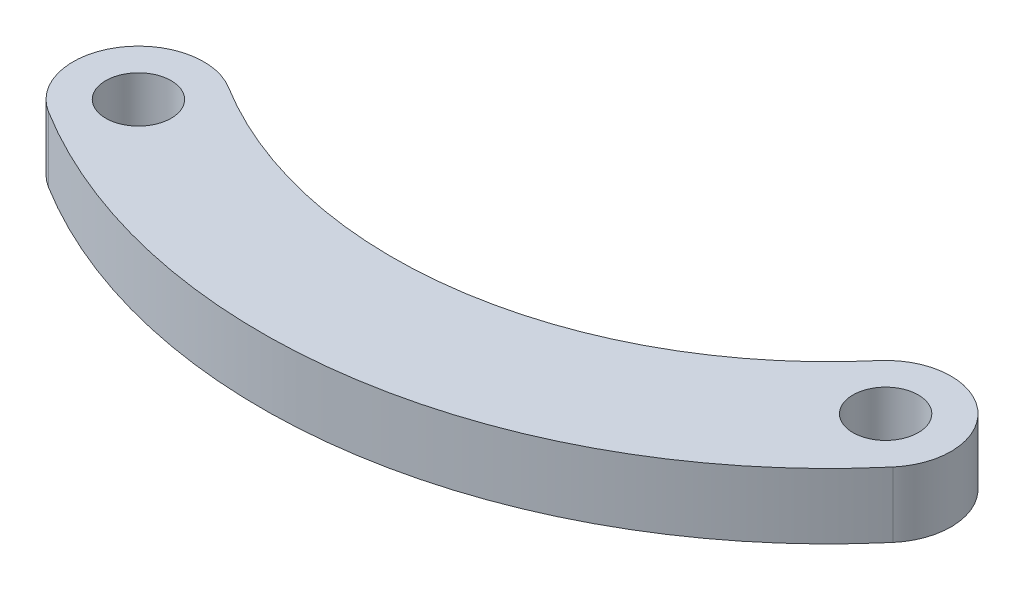
ISO-10303-21;
HEADER;
FILE_DESCRIPTION(('STEP AP214'),'2;1');
FILE_NAME('part.step','',(''),(''),'','','');
FILE_SCHEMA(('AUTOMOTIVE_DESIGN { 1 0 10303 214 1 1 1 1 }'));
ENDSEC;
DATA;
#1=APPLICATION_CONTEXT('core data for automotive mechanical design processes');
#2=APPLICATION_PROTOCOL_DEFINITION('international standard','automotive_design',2000,#1);
#3=PRODUCT_CONTEXT('',#1,'mechanical');
#4=PRODUCT('Part','Part','',(#3));
#5=PRODUCT_RELATED_PRODUCT_CATEGORY('part','',(#4));
#6=PRODUCT_DEFINITION_FORMATION('','',#4);
#7=PRODUCT_DEFINITION_CONTEXT('part definition',#1,'design');
#8=PRODUCT_DEFINITION('design','',#6,#7);
#9=PRODUCT_DEFINITION_SHAPE('','',#8);
#10=(LENGTH_UNIT() NAMED_UNIT(*) SI_UNIT(.MILLI.,.METRE.));
#11=(NAMED_UNIT(*) PLANE_ANGLE_UNIT() SI_UNIT($,.RADIAN.));
#12=(NAMED_UNIT(*) SI_UNIT($,.STERADIAN.) SOLID_ANGLE_UNIT());
#13=UNCERTAINTY_MEASURE_WITH_UNIT(LENGTH_MEASURE(1.E-05),#10,'distance_accuracy_value','');
#14=(GEOMETRIC_REPRESENTATION_CONTEXT(3) GLOBAL_UNCERTAINTY_ASSIGNED_CONTEXT((#13)) GLOBAL_UNIT_ASSIGNED_CONTEXT((#10,
#11,#12)) REPRESENTATION_CONTEXT('',''));
#15=CARTESIAN_POINT('',(0.,0.,0.));
#16=DIRECTION('',(0.,0.,1.));
#17=DIRECTION('',(1.,0.,0.));
#18=AXIS2_PLACEMENT_3D('',#15,#16,#17);
#19=CARTESIAN_POINT('',(-38.4645273407542,19.05,62.0735914979339));
#20=DIRECTION('',(0.,1.,0.));
#21=DIRECTION('',(0.,0.,1.));
#22=AXIS2_PLACEMENT_3D('',#19,#20,#21);
#23=PLANE('',#22);
#24=CARTESIAN_POINT('',(-76.9290546815084,19.05,124.147182995868));
#25=DIRECTION('',(0.,1.,0.));
#26=DIRECTION('',(0.,0.,1.));
#27=AXIS2_PLACEMENT_3D('',#24,#25,#26);
#28=CIRCLE('',#27,9.52500000000001);
#29=CARTESIAN_POINT('',(-76.9290546815084,19.05,114.622182995868));
#30=VERTEX_POINT('',#29);
#31=EDGE_CURVE('E100',#30,#30,#28,.T.);
#32=ORIENTED_EDGE('',*,*,#31,.F.);
#33=EDGE_LOOP('',(#32));
#34=FACE_BOUND('',#33,.T.);
#35=CARTESIAN_POINT('',(-76.9290546815084,19.05,124.147182995868));
#36=DIRECTION('',(0.,1.,0.));
#37=DIRECTION('',(0.,0.,1.));
#38=AXIS2_PLACEMENT_3D('',#35,#36,#37);
#39=CIRCLE('',#38,19.05);
#40=CARTESIAN_POINT('',(-66.8948301578335,19.05,107.95407217032));
#41=VERTEX_POINT('',#40);
#42=CARTESIAN_POINT('',(-86.9632792051835,19.05,140.340293821416));
#43=VERTEX_POINT('',#42);
#44=EDGE_CURVE('E85',#41,#43,#39,.T.);
#45=ORIENTED_EDGE('',*,*,#44,.T.);
#46=CARTESIAN_POINT('',(0.,19.05,0.));
#47=DIRECTION('',(0.,1.,0.));
#48=DIRECTION('',(0.,0.,1.));
#49=AXIS2_PLACEMENT_3D('',#46,#47,#48);
#50=CIRCLE('',#49,165.1);
#51=CARTESIAN_POINT('',(125.779584044827,19.05,106.946277342928));
#52=VERTEX_POINT('',#51);
#53=EDGE_CURVE('E80',#43,#52,#50,.T.);
#54=ORIENTED_EDGE('',*,*,#53,.T.);
#55=CARTESIAN_POINT('',(111.266555116578,19.05,94.6063222648974));
#56=DIRECTION('',(0.,1.,0.));
#57=DIRECTION('',(0.,0.,1.));
#58=AXIS2_PLACEMENT_3D('',#55,#56,#57);
#59=CIRCLE('',#58,19.05);
#60=CARTESIAN_POINT('',(96.7535261883283,19.05,82.2663671868673));
#61=VERTEX_POINT('',#60);
#62=EDGE_CURVE('E83',#52,#61,#59,.T.);
#63=ORIENTED_EDGE('',*,*,#62,.T.);
#64=CARTESIAN_POINT('',(0.,19.05,0.));
#65=DIRECTION('',(0.,-1.,0.));
#66=DIRECTION('',(0.,0.,1.));
#67=AXIS2_PLACEMENT_3D('',#64,#65,#66);
#68=CIRCLE('',#67,127.);
#69=EDGE_CURVE('E50',#61,#41,#68,.T.);
#70=ORIENTED_EDGE('',*,*,#69,.T.);
#71=EDGE_LOOP('',(#45,#54,#63,#70));
#72=FACE_BOUND('',#71,.T.);
#73=CARTESIAN_POINT('',(111.266555116578,19.05,94.6063222648974));
#74=DIRECTION('',(0.,1.,0.));
#75=DIRECTION('',(0.,0.,1.));
#76=AXIS2_PLACEMENT_3D('',#73,#74,#75);
#77=CIRCLE('',#76,9.52500000000001);
#78=CARTESIAN_POINT('',(111.266555116578,19.05,85.0813222648974));
#79=VERTEX_POINT('',#78);
#80=EDGE_CURVE('E115',#79,#79,#77,.T.);
#81=ORIENTED_EDGE('',*,*,#80,.F.);
#82=EDGE_LOOP('',(#81));
#83=FACE_BOUND('',#82,.T.);
#84=ADVANCED_FACE('F33',(#34,#72,#83),#23,.T.);
#85=CARTESIAN_POINT('',(-38.4645273407542,0.,62.0735914979339));
#86=DIRECTION('',(0.,1.,0.));
#87=DIRECTION('',(0.,0.,1.));
#88=AXIS2_PLACEMENT_3D('',#85,#86,#87);
#89=PLANE('',#88);
#90=CARTESIAN_POINT('',(-76.9290546815084,0.,124.147182995868));
#91=DIRECTION('',(0.,1.,0.));
#92=DIRECTION('',(0.,0.,1.));
#93=AXIS2_PLACEMENT_3D('',#90,#91,#92);
#94=CIRCLE('',#93,19.05);
#95=CARTESIAN_POINT('',(-66.8948301578335,0.,107.95407217032));
#96=VERTEX_POINT('',#95);
#97=CARTESIAN_POINT('',(-86.9632792051835,0.,140.340293821416));
#98=VERTEX_POINT('',#97);
#99=EDGE_CURVE('E97',#96,#98,#94,.T.);
#100=ORIENTED_EDGE('',*,*,#99,.F.);
#101=CARTESIAN_POINT('',(0.,0.,0.));
#102=DIRECTION('',(0.,-1.,0.));
#103=DIRECTION('',(0.,0.,1.));
#104=AXIS2_PLACEMENT_3D('',#101,#102,#103);
#105=CIRCLE('',#104,127.);
#106=CARTESIAN_POINT('',(96.7535261883283,0.,82.2663671868673));
#107=VERTEX_POINT('',#106);
#108=EDGE_CURVE('E73',#107,#96,#105,.T.);
#109=ORIENTED_EDGE('',*,*,#108,.F.);
#110=CARTESIAN_POINT('',(111.266555116578,0.,94.6063222648974));
#111=DIRECTION('',(0.,1.,0.));
#112=DIRECTION('',(0.,0.,1.));
#113=AXIS2_PLACEMENT_3D('',#110,#111,#112);
#114=CIRCLE('',#113,19.05);
#115=CARTESIAN_POINT('',(125.779584044827,0.,106.946277342928));
#116=VERTEX_POINT('',#115);
#117=EDGE_CURVE('E67',#116,#107,#114,.T.);
#118=ORIENTED_EDGE('',*,*,#117,.F.);
#119=CARTESIAN_POINT('',(0.,0.,0.));
#120=DIRECTION('',(0.,1.,0.));
#121=DIRECTION('',(0.,0.,1.));
#122=AXIS2_PLACEMENT_3D('',#119,#120,#121);
#123=CIRCLE('',#122,165.1);
#124=EDGE_CURVE('E89',#98,#116,#123,.T.);
#125=ORIENTED_EDGE('',*,*,#124,.F.);
#126=EDGE_LOOP('',(#100,#109,#118,#125));
#127=FACE_BOUND('',#126,.T.);
#128=CARTESIAN_POINT('',(-76.9290546815084,0.,124.147182995868));
#129=DIRECTION('',(0.,1.,0.));
#130=DIRECTION('',(0.,0.,1.));
#131=AXIS2_PLACEMENT_3D('',#128,#129,#130);
#132=CIRCLE('',#131,9.52500000000001);
#133=CARTESIAN_POINT('',(-76.9290546815084,0.,114.622182995868));
#134=VERTEX_POINT('',#133);
#135=EDGE_CURVE('E112',#134,#134,#132,.T.);
#136=ORIENTED_EDGE('',*,*,#135,.T.);
#137=EDGE_LOOP('',(#136));
#138=FACE_BOUND('',#137,.T.);
#139=CARTESIAN_POINT('',(111.266555116578,0.,94.6063222648974));
#140=DIRECTION('',(0.,1.,0.));
#141=DIRECTION('',(0.,0.,1.));
#142=AXIS2_PLACEMENT_3D('',#139,#140,#141);
#143=CIRCLE('',#142,9.52500000000001);
#144=CARTESIAN_POINT('',(111.266555116578,0.,85.0813222648974));
#145=VERTEX_POINT('',#144);
#146=EDGE_CURVE('E118',#145,#145,#143,.T.);
#147=ORIENTED_EDGE('',*,*,#146,.T.);
#148=EDGE_LOOP('',(#147));
#149=FACE_BOUND('',#148,.T.);
#150=ADVANCED_FACE('F108',(#127,#138,#149),#89,.F.);
#151=CARTESIAN_POINT('',(-76.9290546815084,19.05,124.147182995868));
#152=DIRECTION('',(0.,-1.,0.));
#153=DIRECTION('',(0.,0.,-1.));
#154=AXIS2_PLACEMENT_3D('',#151,#152,#153);
#155=CYLINDRICAL_SURFACE('',#154,19.05);
#156=ORIENTED_EDGE('',*,*,#99,.T.);
#157=DIRECTION('',(0.,-1.,0.));
#158=VECTOR('',#157,1.);
#159=CARTESIAN_POINT('',(-86.9632792051835,19.05,140.340293821416));
#160=LINE('',#159,#158);
#161=EDGE_CURVE('E11',#43,#98,#160,.T.);
#162=ORIENTED_EDGE('',*,*,#161,.F.);
#163=ORIENTED_EDGE('',*,*,#44,.F.);
#164=DIRECTION('',(0.,-1.,0.));
#165=VECTOR('',#164,1.);
#166=CARTESIAN_POINT('',(-66.8948301578335,19.05,107.95407217032));
#167=LINE('',#166,#165);
#168=EDGE_CURVE('E93',#41,#96,#167,.T.);
#169=ORIENTED_EDGE('',*,*,#168,.T.);
#170=EDGE_LOOP('',(#156,#162,#163,#169));
#171=FACE_BOUND('',#170,.T.);
#172=ADVANCED_FACE('F35',(#171),#155,.T.);
#173=CARTESIAN_POINT('',(0.,19.05,0.));
#174=DIRECTION('',(0.,-1.,0.));
#175=DIRECTION('',(0.,0.,-1.));
#176=AXIS2_PLACEMENT_3D('',#173,#174,#175);
#177=CYLINDRICAL_SURFACE('',#176,165.1);
#178=ORIENTED_EDGE('',*,*,#124,.T.);
#179=DIRECTION('',(0.,-1.,0.));
#180=VECTOR('',#179,1.);
#181=CARTESIAN_POINT('',(125.779584044827,19.05,106.946277342928));
#182=LINE('',#181,#180);
#183=EDGE_CURVE('E42',#52,#116,#182,.T.);
#184=ORIENTED_EDGE('',*,*,#183,.F.);
#185=ORIENTED_EDGE('',*,*,#53,.F.);
#186=ORIENTED_EDGE('',*,*,#161,.T.);
#187=EDGE_LOOP('',(#178,#184,#185,#186));
#188=FACE_BOUND('',#187,.T.);
#189=ADVANCED_FACE('F88',(#188),#177,.T.);
#190=CARTESIAN_POINT('',(111.266555116578,19.05,94.6063222648974));
#191=DIRECTION('',(0.,-1.,0.));
#192=DIRECTION('',(0.,0.,-1.));
#193=AXIS2_PLACEMENT_3D('',#190,#191,#192);
#194=CYLINDRICAL_SURFACE('',#193,19.05);
#195=ORIENTED_EDGE('',*,*,#117,.T.);
#196=DIRECTION('',(0.,-1.,0.));
#197=VECTOR('',#196,1.);
#198=CARTESIAN_POINT('',(96.7535261883283,19.05,82.2663671868673));
#199=LINE('',#198,#197);
#200=EDGE_CURVE('E90',#61,#107,#199,.T.);
#201=ORIENTED_EDGE('',*,*,#200,.F.);
#202=ORIENTED_EDGE('',*,*,#62,.F.);
#203=ORIENTED_EDGE('',*,*,#183,.T.);
#204=EDGE_LOOP('',(#195,#201,#202,#203));
#205=FACE_BOUND('',#204,.T.);
#206=ADVANCED_FACE('F91',(#205),#194,.T.);
#207=CARTESIAN_POINT('',(0.,19.05,0.));
#208=DIRECTION('',(0.,-1.,0.));
#209=DIRECTION('',(0.,0.,-1.));
#210=AXIS2_PLACEMENT_3D('',#207,#208,#209);
#211=CYLINDRICAL_SURFACE('',#210,127.);
#212=ORIENTED_EDGE('',*,*,#108,.T.);
#213=ORIENTED_EDGE('',*,*,#168,.F.);
#214=ORIENTED_EDGE('',*,*,#69,.F.);
#215=ORIENTED_EDGE('',*,*,#200,.T.);
#216=EDGE_LOOP('',(#212,#213,#214,#215));
#217=FACE_BOUND('',#216,.T.);
#218=ADVANCED_FACE('F105',(#217),#211,.F.);
#219=CARTESIAN_POINT('',(-76.9290546815084,19.05,124.147182995868));
#220=DIRECTION('',(0.,-1.,0.));
#221=DIRECTION('',(0.,0.,-1.));
#222=AXIS2_PLACEMENT_3D('',#219,#220,#221);
#223=CYLINDRICAL_SURFACE('',#222,9.52500000000001);
#224=CARTESIAN_POINT('',(-76.9290546815084,19.05,114.622182995868));
#225=CARTESIAN_POINT('',(-76.9290546815084,18.8515625,114.622182995868));
#226=CARTESIAN_POINT('',(-76.9290546815084,18.653125,114.622182995868));
#227=CARTESIAN_POINT('',(-76.9290546815084,18.25625,114.622182995868));
#228=CARTESIAN_POINT('',(-76.9290546815084,18.0578125,114.622182995868));
#229=CARTESIAN_POINT('',(-76.9290546815084,17.6609375,114.622182995868));
#230=CARTESIAN_POINT('',(-76.9290546815084,17.4625,114.622182995868));
#231=CARTESIAN_POINT('',(-76.9290546815084,17.065625,114.622182995868));
#232=CARTESIAN_POINT('',(-76.9290546815084,16.8671875,114.622182995868));
#233=CARTESIAN_POINT('',(-76.9290546815084,16.4703125,114.622182995868));
#234=CARTESIAN_POINT('',(-76.9290546815084,16.271875,114.622182995868));
#235=CARTESIAN_POINT('',(-76.9290546815084,15.875,114.622182995868));
#236=CARTESIAN_POINT('',(-76.9290546815084,15.6765625,114.622182995868));
#237=CARTESIAN_POINT('',(-76.9290546815084,15.2796875,114.622182995868));
#238=CARTESIAN_POINT('',(-76.9290546815084,15.08125,114.622182995868));
#239=CARTESIAN_POINT('',(-76.9290546815084,14.684375,114.622182995868));
#240=CARTESIAN_POINT('',(-76.9290546815084,14.4859375,114.622182995868));
#241=CARTESIAN_POINT('',(-76.9290546815084,14.0890625,114.622182995868));
#242=CARTESIAN_POINT('',(-76.9290546815084,13.890625,114.622182995868));
#243=CARTESIAN_POINT('',(-76.9290546815084,13.49375,114.622182995868));
#244=CARTESIAN_POINT('',(-76.9290546815084,13.2953125,114.622182995868));
#245=CARTESIAN_POINT('',(-76.9290546815084,12.8984375,114.622182995868));
#246=CARTESIAN_POINT('',(-76.9290546815084,12.7,114.622182995868));
#247=CARTESIAN_POINT('',(-76.9290546815084,12.303125,114.622182995868));
#248=CARTESIAN_POINT('',(-76.9290546815084,12.1046875,114.622182995868));
#249=CARTESIAN_POINT('',(-76.9290546815084,11.7078125,114.622182995868));
#250=CARTESIAN_POINT('',(-76.9290546815084,11.509375,114.622182995868));
#251=CARTESIAN_POINT('',(-76.9290546815084,11.1125,114.622182995868));
#252=CARTESIAN_POINT('',(-76.9290546815084,10.9140625,114.622182995868));
#253=CARTESIAN_POINT('',(-76.9290546815084,10.5171875,114.622182995868));
#254=CARTESIAN_POINT('',(-76.9290546815084,10.31875,114.622182995868));
#255=CARTESIAN_POINT('',(-76.9290546815084,9.921875,114.622182995868));
#256=CARTESIAN_POINT('',(-76.9290546815084,9.7234375,114.622182995868));
#257=CARTESIAN_POINT('',(-76.9290546815084,9.3265625,114.622182995868));
#258=CARTESIAN_POINT('',(-76.9290546815084,9.128125,114.622182995868));
#259=CARTESIAN_POINT('',(-76.9290546815084,8.73125,114.622182995868));
#260=CARTESIAN_POINT('',(-76.9290546815084,8.5328125,114.622182995868));
#261=CARTESIAN_POINT('',(-76.9290546815084,8.1359375,114.622182995868));
#262=CARTESIAN_POINT('',(-76.9290546815084,7.9375,114.622182995868));
#263=CARTESIAN_POINT('',(-76.9290546815084,7.540625,114.622182995868));
#264=CARTESIAN_POINT('',(-76.9290546815084,7.3421875,114.622182995868));
#265=CARTESIAN_POINT('',(-76.9290546815084,6.9453125,114.622182995868));
#266=CARTESIAN_POINT('',(-76.9290546815084,6.746875,114.622182995868));
#267=CARTESIAN_POINT('',(-76.9290546815084,6.35,114.622182995868));
#268=CARTESIAN_POINT('',(-76.9290546815084,6.1515625,114.622182995868));
#269=CARTESIAN_POINT('',(-76.9290546815084,5.7546875,114.622182995868));
#270=CARTESIAN_POINT('',(-76.9290546815084,5.55625,114.622182995868));
#271=CARTESIAN_POINT('',(-76.9290546815084,5.159375,114.622182995868));
#272=CARTESIAN_POINT('',(-76.9290546815084,4.9609375,114.622182995868));
#273=CARTESIAN_POINT('',(-76.9290546815084,4.5640625,114.622182995868));
#274=CARTESIAN_POINT('',(-76.9290546815084,4.365625,114.622182995868));
#275=CARTESIAN_POINT('',(-76.9290546815084,3.96875,114.622182995868));
#276=CARTESIAN_POINT('',(-76.9290546815084,3.7703125,114.622182995868));
#277=CARTESIAN_POINT('',(-76.9290546815084,3.3734375,114.622182995868));
#278=CARTESIAN_POINT('',(-76.9290546815084,3.175,114.622182995868));
#279=CARTESIAN_POINT('',(-76.9290546815084,2.778125,114.622182995868));
#280=CARTESIAN_POINT('',(-76.9290546815084,2.5796875,114.622182995868));
#281=CARTESIAN_POINT('',(-76.9290546815084,2.1828125,114.622182995868));
#282=CARTESIAN_POINT('',(-76.9290546815084,1.984375,114.622182995868));
#283=CARTESIAN_POINT('',(-76.9290546815084,1.5875,114.622182995868));
#284=CARTESIAN_POINT('',(-76.9290546815084,1.3890625,114.622182995868));
#285=CARTESIAN_POINT('',(-76.9290546815084,0.992187500000001,114.622182995868));
#286=CARTESIAN_POINT('',(-76.9290546815084,0.793750000000001,114.622182995868));
#287=CARTESIAN_POINT('',(-76.9290546815084,0.396875,114.622182995868));
#288=CARTESIAN_POINT('',(-76.9290546815084,0.1984375,114.622182995868));
#289=CARTESIAN_POINT('',(-76.9290546815084,0.,114.622182995868));
#290=B_SPLINE_CURVE_WITH_KNOTS('',3,(#224,#225,#226,#227,#228,#229,#230,#231,#232,#233,#234,
#235,#236,#237,#238,#239,#240,#241,#242,#243,#244,#245,#246,#247,#248,#249,#250,#251,#252,#253,
#254,#255,#256,#257,#258,#259,#260,#261,#262,#263,#264,#265,#266,#267,#268,#269,#270,#271,#272,
#273,#274,#275,#276,#277,#278,#279,#280,#281,#282,#283,#284,#285,#286,#287,#288,#289),
.UNSPECIFIED.,.F.,.F.,(4,2,2,2,2,2,2,2,2,2,2,2,2,2,2,2,2,2,2,2,2,2,2,2,2,2,2,2,2,2,2,2,4),(0.,
0.5953125,1.190625,1.7859375,2.38125,2.9765625,3.571875,4.1671875,4.7625,5.3578125,5.953125,
6.5484375,7.14375,7.7390625,8.334375,8.9296875,9.525,10.1203125,10.715625,11.3109375,11.90625,
12.5015625,13.096875,13.6921875,14.2875,14.8828125,15.478125,16.0734375,16.66875,17.2640625,
17.859375,18.4546875,19.05),.UNSPECIFIED.);
#291=EDGE_CURVE('BSEAM135',#30,#134,#290,.T.);
#292=ORIENTED_EDGE('',*,*,#31,.T.);
#293=ORIENTED_EDGE('',*,*,#135,.F.);
#294=ORIENTED_EDGE('',*,*,#291,.T.);
#295=ORIENTED_EDGE('',*,*,#291,.F.);
#296=EDGE_LOOP('',(#292,#294,#293,#295));
#297=FACE_BOUND('',#296,.T.);
#298=ADVANCED_FACE('F135',(#297),#223,.F.);
#299=CARTESIAN_POINT('',(111.266555116578,19.05,94.6063222648974));
#300=DIRECTION('',(0.,-1.,0.));
#301=DIRECTION('',(0.,0.,-1.));
#302=AXIS2_PLACEMENT_3D('',#299,#300,#301);
#303=CYLINDRICAL_SURFACE('',#302,9.52500000000001);
#304=CARTESIAN_POINT('',(111.266555116578,19.05,85.0813222648974));
#305=CARTESIAN_POINT('',(111.266555116578,18.8515625,85.0813222648974));
#306=CARTESIAN_POINT('',(111.266555116578,18.653125,85.0813222648974));
#307=CARTESIAN_POINT('',(111.266555116578,18.25625,85.0813222648974));
#308=CARTESIAN_POINT('',(111.266555116578,18.0578125,85.0813222648974));
#309=CARTESIAN_POINT('',(111.266555116578,17.6609375,85.0813222648974));
#310=CARTESIAN_POINT('',(111.266555116578,17.4625,85.0813222648974));
#311=CARTESIAN_POINT('',(111.266555116578,17.065625,85.0813222648974));
#312=CARTESIAN_POINT('',(111.266555116578,16.8671875,85.0813222648974));
#313=CARTESIAN_POINT('',(111.266555116578,16.4703125,85.0813222648974));
#314=CARTESIAN_POINT('',(111.266555116578,16.271875,85.0813222648974));
#315=CARTESIAN_POINT('',(111.266555116578,15.875,85.0813222648974));
#316=CARTESIAN_POINT('',(111.266555116578,15.6765625,85.0813222648974));
#317=CARTESIAN_POINT('',(111.266555116578,15.2796875,85.0813222648974));
#318=CARTESIAN_POINT('',(111.266555116578,15.08125,85.0813222648974));
#319=CARTESIAN_POINT('',(111.266555116578,14.684375,85.0813222648974));
#320=CARTESIAN_POINT('',(111.266555116578,14.4859375,85.0813222648974));
#321=CARTESIAN_POINT('',(111.266555116578,14.0890625,85.0813222648974));
#322=CARTESIAN_POINT('',(111.266555116578,13.890625,85.0813222648974));
#323=CARTESIAN_POINT('',(111.266555116578,13.49375,85.0813222648974));
#324=CARTESIAN_POINT('',(111.266555116578,13.2953125,85.0813222648974));
#325=CARTESIAN_POINT('',(111.266555116578,12.8984375,85.0813222648974));
#326=CARTESIAN_POINT('',(111.266555116578,12.7,85.0813222648974));
#327=CARTESIAN_POINT('',(111.266555116578,12.303125,85.0813222648974));
#328=CARTESIAN_POINT('',(111.266555116578,12.1046875,85.0813222648974));
#329=CARTESIAN_POINT('',(111.266555116578,11.7078125,85.0813222648974));
#330=CARTESIAN_POINT('',(111.266555116578,11.509375,85.0813222648974));
#331=CARTESIAN_POINT('',(111.266555116578,11.1125,85.0813222648974));
#332=CARTESIAN_POINT('',(111.266555116578,10.9140625,85.0813222648974));
#333=CARTESIAN_POINT('',(111.266555116578,10.5171875,85.0813222648974));
#334=CARTESIAN_POINT('',(111.266555116578,10.31875,85.0813222648974));
#335=CARTESIAN_POINT('',(111.266555116578,9.921875,85.0813222648974));
#336=CARTESIAN_POINT('',(111.266555116578,9.7234375,85.0813222648974));
#337=CARTESIAN_POINT('',(111.266555116578,9.3265625,85.0813222648974));
#338=CARTESIAN_POINT('',(111.266555116578,9.128125,85.0813222648974));
#339=CARTESIAN_POINT('',(111.266555116578,8.73125,85.0813222648974));
#340=CARTESIAN_POINT('',(111.266555116578,8.5328125,85.0813222648974));
#341=CARTESIAN_POINT('',(111.266555116578,8.1359375,85.0813222648974));
#342=CARTESIAN_POINT('',(111.266555116578,7.9375,85.0813222648974));
#343=CARTESIAN_POINT('',(111.266555116578,7.540625,85.0813222648974));
#344=CARTESIAN_POINT('',(111.266555116578,7.3421875,85.0813222648974));
#345=CARTESIAN_POINT('',(111.266555116578,6.9453125,85.0813222648974));
#346=CARTESIAN_POINT('',(111.266555116578,6.746875,85.0813222648974));
#347=CARTESIAN_POINT('',(111.266555116578,6.35,85.0813222648974));
#348=CARTESIAN_POINT('',(111.266555116578,6.1515625,85.0813222648974));
#349=CARTESIAN_POINT('',(111.266555116578,5.7546875,85.0813222648974));
#350=CARTESIAN_POINT('',(111.266555116578,5.55625,85.0813222648974));
#351=CARTESIAN_POINT('',(111.266555116578,5.159375,85.0813222648974));
#352=CARTESIAN_POINT('',(111.266555116578,4.9609375,85.0813222648974));
#353=CARTESIAN_POINT('',(111.266555116578,4.5640625,85.0813222648974));
#354=CARTESIAN_POINT('',(111.266555116578,4.365625,85.0813222648974));
#355=CARTESIAN_POINT('',(111.266555116578,3.96875,85.0813222648974));
#356=CARTESIAN_POINT('',(111.266555116578,3.7703125,85.0813222648974));
#357=CARTESIAN_POINT('',(111.266555116578,3.3734375,85.0813222648974));
#358=CARTESIAN_POINT('',(111.266555116578,3.175,85.0813222648974));
#359=CARTESIAN_POINT('',(111.266555116578,2.778125,85.0813222648974));
#360=CARTESIAN_POINT('',(111.266555116578,2.5796875,85.0813222648974));
#361=CARTESIAN_POINT('',(111.266555116578,2.1828125,85.0813222648974));
#362=CARTESIAN_POINT('',(111.266555116578,1.984375,85.0813222648974));
#363=CARTESIAN_POINT('',(111.266555116578,1.5875,85.0813222648974));
#364=CARTESIAN_POINT('',(111.266555116578,1.3890625,85.0813222648974));
#365=CARTESIAN_POINT('',(111.266555116578,0.992187500000001,85.0813222648974));
#366=CARTESIAN_POINT('',(111.266555116578,0.793750000000001,85.0813222648974));
#367=CARTESIAN_POINT('',(111.266555116578,0.396875,85.0813222648974));
#368=CARTESIAN_POINT('',(111.266555116578,0.1984375,85.0813222648974));
#369=CARTESIAN_POINT('',(111.266555116578,0.,85.0813222648974));
#370=B_SPLINE_CURVE_WITH_KNOTS('',3,(#304,#305,#306,#307,#308,#309,#310,#311,#312,#313,#314,
#315,#316,#317,#318,#319,#320,#321,#322,#323,#324,#325,#326,#327,#328,#329,#330,#331,#332,#333,
#334,#335,#336,#337,#338,#339,#340,#341,#342,#343,#344,#345,#346,#347,#348,#349,#350,#351,#352,
#353,#354,#355,#356,#357,#358,#359,#360,#361,#362,#363,#364,#365,#366,#367,#368,#369),
.UNSPECIFIED.,.F.,.F.,(4,2,2,2,2,2,2,2,2,2,2,2,2,2,2,2,2,2,2,2,2,2,2,2,2,2,2,2,2,2,2,2,4),(0.,
0.5953125,1.190625,1.7859375,2.38125,2.9765625,3.571875,4.1671875,4.7625,5.3578125,5.953125,
6.5484375,7.14375,7.7390625,8.334375,8.9296875,9.525,10.1203125,10.715625,11.3109375,11.90625,
12.5015625,13.096875,13.6921875,14.2875,14.8828125,15.478125,16.0734375,16.66875,17.2640625,
17.859375,18.4546875,19.05),.UNSPECIFIED.);
#371=EDGE_CURVE('BSEAM124',#79,#145,#370,.T.);
#372=ORIENTED_EDGE('',*,*,#80,.T.);
#373=ORIENTED_EDGE('',*,*,#146,.F.);
#374=ORIENTED_EDGE('',*,*,#371,.T.);
#375=ORIENTED_EDGE('',*,*,#371,.F.);
#376=EDGE_LOOP('',(#372,#374,#373,#375));
#377=FACE_BOUND('',#376,.T.);
#378=ADVANCED_FACE('F124',(#377),#303,.F.);
#379=CLOSED_SHELL('',(#84,#150,#172,#189,#206,#218,#298,#378));
#380=MANIFOLD_SOLID_BREP('B2',#379);
#381=ADVANCED_BREP_SHAPE_REPRESENTATION('',(#18,#380),#14);
#382=SHAPE_DEFINITION_REPRESENTATION(#9,#381);
ENDSEC;
END-ISO-10303-21;
